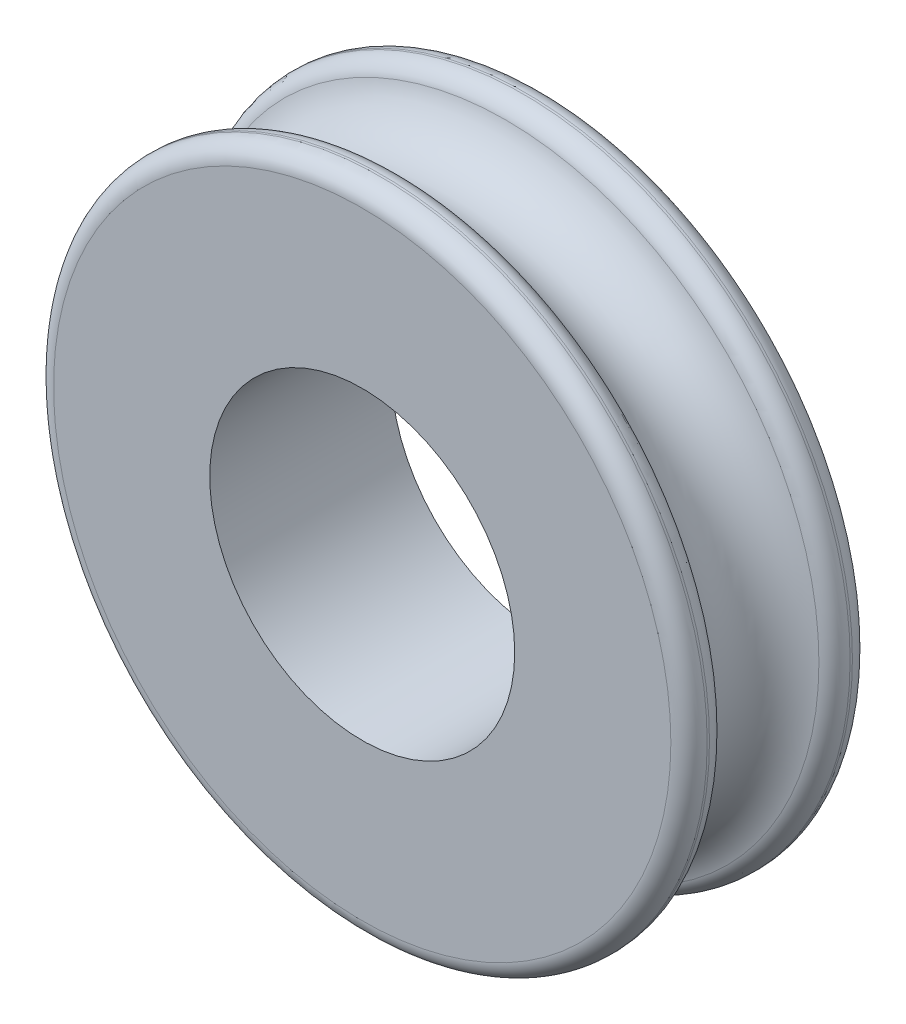
ISO-10303-21;
HEADER;
FILE_DESCRIPTION(('STEP AP214'),'2;1');
FILE_NAME('part.step','',(''),(''),'','','');
FILE_SCHEMA(('AUTOMOTIVE_DESIGN { 1 0 10303 214 1 1 1 1 }'));
ENDSEC;
DATA;
#1=APPLICATION_CONTEXT('core data for automotive mechanical design processes');
#2=APPLICATION_PROTOCOL_DEFINITION('international standard','automotive_design',2000,#1);
#3=PRODUCT_CONTEXT('',#1,'mechanical');
#4=PRODUCT('Part','Part','',(#3));
#5=PRODUCT_RELATED_PRODUCT_CATEGORY('part','',(#4));
#6=PRODUCT_DEFINITION_FORMATION('','',#4);
#7=PRODUCT_DEFINITION_CONTEXT('part definition',#1,'design');
#8=PRODUCT_DEFINITION('design','',#6,#7);
#9=PRODUCT_DEFINITION_SHAPE('','',#8);
#10=(LENGTH_UNIT() NAMED_UNIT(*) SI_UNIT(.MILLI.,.METRE.));
#11=(NAMED_UNIT(*) PLANE_ANGLE_UNIT() SI_UNIT($,.RADIAN.));
#12=(NAMED_UNIT(*) SI_UNIT($,.STERADIAN.) SOLID_ANGLE_UNIT());
#13=UNCERTAINTY_MEASURE_WITH_UNIT(LENGTH_MEASURE(1.E-05),#10,'distance_accuracy_value','');
#14=(GEOMETRIC_REPRESENTATION_CONTEXT(3) GLOBAL_UNCERTAINTY_ASSIGNED_CONTEXT((#13)) GLOBAL_UNIT_ASSIGNED_CONTEXT((#10,
#11,#12)) REPRESENTATION_CONTEXT('',''));
#15=CARTESIAN_POINT('',(0.,0.,0.));
#16=DIRECTION('',(0.,0.,1.));
#17=DIRECTION('',(1.,0.,0.));
#18=AXIS2_PLACEMENT_3D('',#15,#16,#17);
#19=CARTESIAN_POINT('',(0.,0.,2.5));
#20=DIRECTION('',(0.,0.,-1.));
#21=DIRECTION('',(-1.,0.,0.));
#22=AXIS2_PLACEMENT_3D('',#19,#20,#21);
#23=CYLINDRICAL_SURFACE('',#22,9.);
#24=CARTESIAN_POINT('',(0.,0.,1.93649167310371));
#25=DIRECTION('',(0.,0.,-1.));
#26=DIRECTION('',(-1.,0.,0.));
#27=AXIS2_PLACEMENT_3D('',#24,#25,#26);
#28=CIRCLE('',#27,9.);
#29=CARTESIAN_POINT('',(9.,0.,1.93649167310371));
#30=VERTEX_POINT('',#29);
#31=EDGE_CURVE('E69',#30,#30,#28,.F.);
#32=ORIENTED_EDGE('',*,*,#31,.T.);
#33=EDGE_LOOP('',(#32));
#34=FACE_BOUND('',#33,.T.);
#35=CARTESIAN_POINT('',(0.,0.,2.));
#36=DIRECTION('',(0.,0.,1.));
#37=DIRECTION('',(1.,0.,0.));
#38=AXIS2_PLACEMENT_3D('',#35,#36,#37);
#39=CIRCLE('',#38,9.);
#40=CARTESIAN_POINT('',(9.,0.,2.));
#41=VERTEX_POINT('',#40);
#42=EDGE_CURVE('E95',#41,#41,#39,.F.);
#43=ORIENTED_EDGE('',*,*,#42,.T.);
#44=EDGE_LOOP('',(#43));
#45=FACE_BOUND('',#44,.T.);
#46=ADVANCED_FACE('F39',(#34,#45),#23,.T.);
#47=CARTESIAN_POINT('',(0.,0.,2.5));
#48=DIRECTION('',(0.,0.,1.));
#49=DIRECTION('',(1.,0.,0.));
#50=AXIS2_PLACEMENT_3D('',#47,#48,#49);
#51=PLANE('',#50);
#52=CARTESIAN_POINT('',(0.,0.,2.5));
#53=DIRECTION('',(0.,0.,1.));
#54=DIRECTION('',(1.,0.,0.));
#55=AXIS2_PLACEMENT_3D('',#52,#53,#54);
#56=CIRCLE('',#55,8.5);
#57=CARTESIAN_POINT('',(8.5,0.,2.5));
#58=VERTEX_POINT('',#57);
#59=EDGE_CURVE('E99',#58,#58,#56,.T.);
#60=ORIENTED_EDGE('',*,*,#59,.T.);
#61=EDGE_LOOP('',(#60));
#62=FACE_BOUND('',#61,.T.);
#63=CARTESIAN_POINT('',(0.,0.,2.5));
#64=DIRECTION('',(0.,0.,1.));
#65=DIRECTION('',(1.,0.,0.));
#66=AXIS2_PLACEMENT_3D('',#63,#64,#65);
#67=CIRCLE('',#66,4.2);
#68=CARTESIAN_POINT('',(4.2,0.,2.5));
#69=VERTEX_POINT('',#68);
#70=EDGE_CURVE('E103',#69,#69,#67,.T.);
#71=ORIENTED_EDGE('',*,*,#70,.F.);
#72=EDGE_LOOP('',(#71));
#73=FACE_BOUND('',#72,.T.);
#74=ADVANCED_FACE('F114',(#62,#73),#51,.T.);
#75=CARTESIAN_POINT('',(0.,0.,-2.5));
#76=DIRECTION('',(0.,0.,1.));
#77=DIRECTION('',(1.,0.,0.));
#78=AXIS2_PLACEMENT_3D('',#75,#76,#77);
#79=PLANE('',#78);
#80=CARTESIAN_POINT('',(0.,0.,-2.5));
#81=DIRECTION('',(0.,0.,1.));
#82=DIRECTION('',(1.,0.,0.));
#83=AXIS2_PLACEMENT_3D('',#80,#81,#82);
#84=CIRCLE('',#83,8.5);
#85=CARTESIAN_POINT('',(8.5,0.,-2.5));
#86=VERTEX_POINT('',#85);
#87=EDGE_CURVE('E87',#86,#86,#84,.F.);
#88=ORIENTED_EDGE('',*,*,#87,.T.);
#89=EDGE_LOOP('',(#88));
#90=FACE_BOUND('',#89,.T.);
#91=CARTESIAN_POINT('',(0.,0.,-2.5));
#92=DIRECTION('',(0.,0.,1.));
#93=DIRECTION('',(1.,0.,0.));
#94=AXIS2_PLACEMENT_3D('',#91,#92,#93);
#95=CIRCLE('',#94,4.2);
#96=CARTESIAN_POINT('',(4.2,0.,-2.5));
#97=VERTEX_POINT('',#96);
#98=EDGE_CURVE('E76',#97,#97,#95,.T.);
#99=ORIENTED_EDGE('',*,*,#98,.T.);
#100=EDGE_LOOP('',(#99));
#101=FACE_BOUND('',#100,.T.);
#102=ADVANCED_FACE('F116',(#90,#101),#79,.F.);
#103=CARTESIAN_POINT('',(0.,0.,-1.93649167310371));
#104=DIRECTION('',(0.,0.,1.));
#105=DIRECTION('',(1.,0.,0.));
#106=AXIS2_PLACEMENT_3D('',#103,#104,#105);
#107=CIRCLE('',#106,9.);
#108=CARTESIAN_POINT('',(9.,0.,-1.93649167310371));
#109=VERTEX_POINT('',#108);
#110=EDGE_CURVE('E11',#109,#109,#107,.F.);
#111=ORIENTED_EDGE('',*,*,#110,.T.);
#112=EDGE_LOOP('',(#111));
#113=FACE_BOUND('',#112,.T.);
#114=CARTESIAN_POINT('',(0.,0.,-2.));
#115=DIRECTION('',(0.,0.,1.));
#116=DIRECTION('',(1.,0.,0.));
#117=AXIS2_PLACEMENT_3D('',#114,#115,#116);
#118=CIRCLE('',#117,9.);
#119=CARTESIAN_POINT('',(9.,0.,-2.));
#120=VERTEX_POINT('',#119);
#121=EDGE_CURVE('E91',#120,#120,#118,.T.);
#122=ORIENTED_EDGE('',*,*,#121,.T.);
#123=EDGE_LOOP('',(#122));
#124=FACE_BOUND('',#123,.T.);
#125=ADVANCED_FACE('F123',(#113,#124),#23,.T.);
#126=CARTESIAN_POINT('',(0.,0.,2.5));
#127=DIRECTION('',(0.,0.,-1.));
#128=DIRECTION('',(-1.,0.,0.));
#129=AXIS2_PLACEMENT_3D('',#126,#127,#128);
#130=CYLINDRICAL_SURFACE('',#129,4.2);
#131=ORIENTED_EDGE('',*,*,#70,.T.);
#132=EDGE_LOOP('',(#131));
#133=FACE_BOUND('',#132,.T.);
#134=ORIENTED_EDGE('',*,*,#98,.F.);
#135=EDGE_LOOP('',(#134));
#136=FACE_BOUND('',#135,.T.);
#137=ADVANCED_FACE('F111',(#133,#136),#130,.F.);
#138=CARTESIAN_POINT('',(0.,0.,0.));
#139=DIRECTION('',(0.,0.,1.));
#140=DIRECTION('',(1.,0.,0.));
#141=AXIS2_PLACEMENT_3D('',#138,#139,#140);
#142=TOROIDAL_SURFACE('',#141,9.,1.5);
#143=CARTESIAN_POINT('',(9.,0.,0.));
#144=DIRECTION('',(0.,1.,0.));
#145=DIRECTION('',(0.,0.,1.));
#146=AXIS2_PLACEMENT_3D('',#143,#144,#145);
#147=CIRCLE('',#146,1.5);
#148=CARTESIAN_POINT('',(8.62500000000016,0.,-1.45236875482787));
#149=VERTEX_POINT('',#148);
#150=CARTESIAN_POINT('',(8.62500000000005,0.,1.45236875482781));
#151=VERTEX_POINT('',#150);
#152=EDGE_CURVE('E72',#149,#151,#147,.T.);
#153=ORIENTED_EDGE('',*,*,#152,.T.);
#154=CARTESIAN_POINT('',(0.,0.,1.45236875482781));
#155=DIRECTION('',(0.,0.,-1.));
#156=DIRECTION('',(-1.,0.,0.));
#157=AXIS2_PLACEMENT_3D('',#154,#155,#156);
#158=CIRCLE('',#157,8.62499999999999);
#159=EDGE_CURVE('E49',#151,#151,#158,.T.);
#160=ORIENTED_EDGE('',*,*,#159,.T.);
#161=ORIENTED_EDGE('',*,*,#152,.F.);
#162=CARTESIAN_POINT('',(0.,0.,-1.45236875482787));
#163=DIRECTION('',(0.,0.,1.));
#164=DIRECTION('',(1.,0.,0.));
#165=AXIS2_PLACEMENT_3D('',#162,#163,#164);
#166=CIRCLE('',#165,8.62499999999998);
#167=EDGE_CURVE('E81',#149,#149,#166,.T.);
#168=ORIENTED_EDGE('',*,*,#167,.T.);
#169=EDGE_LOOP('',(#153,#160,#161,#168));
#170=FACE_BOUND('',#169,.T.);
#171=ADVANCED_FACE('F137',(#170),#142,.F.);
#172=CARTESIAN_POINT('',(0.,0.,2.));
#173=DIRECTION('',(0.,0.,1.));
#174=DIRECTION('',(1.,0.,0.));
#175=AXIS2_PLACEMENT_3D('',#172,#173,#174);
#176=TOROIDAL_SURFACE('',#175,8.5,0.5);
#177=ORIENTED_EDGE('',*,*,#42,.F.);
#178=EDGE_LOOP('',(#177));
#179=FACE_BOUND('',#178,.T.);
#180=ORIENTED_EDGE('',*,*,#59,.F.);
#181=EDGE_LOOP('',(#180));
#182=FACE_BOUND('',#181,.T.);
#183=ADVANCED_FACE('F133',(#179,#182),#176,.T.);
#184=CARTESIAN_POINT('',(0.,0.,-2.));
#185=DIRECTION('',(0.,0.,1.));
#186=DIRECTION('',(1.,0.,0.));
#187=AXIS2_PLACEMENT_3D('',#184,#185,#186);
#188=TOROIDAL_SURFACE('',#187,8.5,0.5);
#189=ORIENTED_EDGE('',*,*,#87,.F.);
#190=EDGE_LOOP('',(#189));
#191=FACE_BOUND('',#190,.T.);
#192=ORIENTED_EDGE('',*,*,#121,.F.);
#193=EDGE_LOOP('',(#192));
#194=FACE_BOUND('',#193,.T.);
#195=ADVANCED_FACE('F136',(#191,#194),#188,.T.);
#196=CARTESIAN_POINT('',(0.,0.,1.93649167310371));
#197=DIRECTION('',(0.,0.,-1.));
#198=DIRECTION('',(-1.,0.,0.));
#199=AXIS2_PLACEMENT_3D('',#196,#197,#198);
#200=TOROIDAL_SURFACE('',#199,8.5,0.5);
#201=CARTESIAN_POINT('',(8.5,0.,1.93649167310371));
#202=DIRECTION('',(0.,-1.,0.));
#203=DIRECTION('',(0.,0.,-1.));
#204=AXIS2_PLACEMENT_3D('',#201,#202,#203);
#205=CIRCLE('',#204,0.5);
#206=EDGE_CURVE('E63',#151,#30,#205,.T.);
#207=ORIENTED_EDGE('',*,*,#206,.F.);
#208=ORIENTED_EDGE('',*,*,#159,.F.);
#209=ORIENTED_EDGE('',*,*,#206,.T.);
#210=ORIENTED_EDGE('',*,*,#31,.F.);
#211=EDGE_LOOP('',(#207,#208,#209,#210));
#212=FACE_BOUND('',#211,.T.);
#213=ADVANCED_FACE('F67',(#212),#200,.T.);
#214=CARTESIAN_POINT('',(0.,0.,-1.93649167310371));
#215=DIRECTION('',(0.,0.,1.));
#216=DIRECTION('',(1.,0.,0.));
#217=AXIS2_PLACEMENT_3D('',#214,#215,#216);
#218=TOROIDAL_SURFACE('',#217,8.5,0.5);
#219=CARTESIAN_POINT('',(8.5,0.,-1.93649167310371));
#220=DIRECTION('',(0.,1.,0.));
#221=DIRECTION('',(0.,0.,1.));
#222=AXIS2_PLACEMENT_3D('',#219,#220,#221);
#223=CIRCLE('',#222,0.5);
#224=EDGE_CURVE('E43',#149,#109,#223,.T.);
#225=ORIENTED_EDGE('',*,*,#224,.F.);
#226=ORIENTED_EDGE('',*,*,#167,.F.);
#227=ORIENTED_EDGE('',*,*,#224,.T.);
#228=ORIENTED_EDGE('',*,*,#110,.F.);
#229=EDGE_LOOP('',(#225,#226,#227,#228));
#230=FACE_BOUND('',#229,.T.);
#231=ADVANCED_FACE('F41',(#230),#218,.T.);
#232=CLOSED_SHELL('',(#46,#74,#102,#125,#137,#171,#183,#195,#213,#231));
#233=MANIFOLD_SOLID_BREP('B2',#232);
#234=ADVANCED_BREP_SHAPE_REPRESENTATION('',(#18,#233),#14);
#235=SHAPE_DEFINITION_REPRESENTATION(#9,#234);
ENDSEC;
END-ISO-10303-21;
